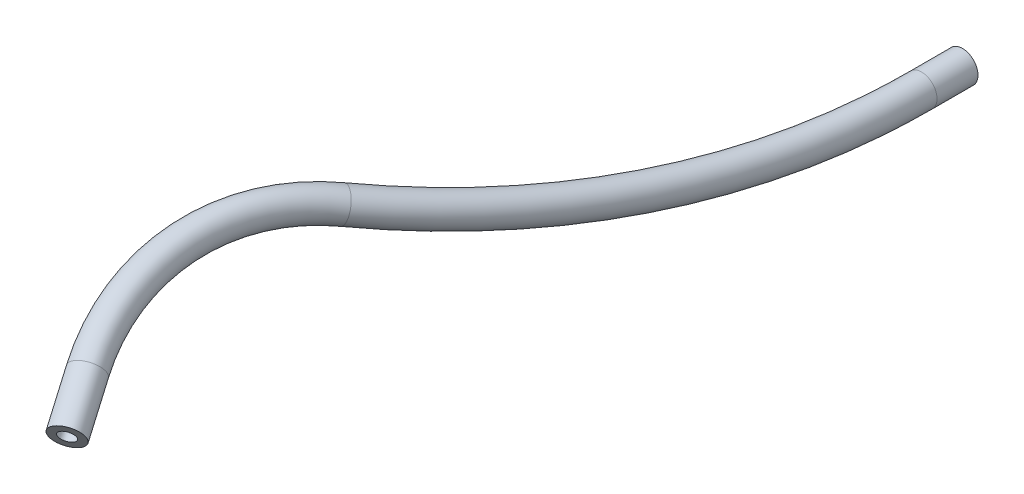
ISO-10303-21;
HEADER;
FILE_DESCRIPTION(('STEP AP214'),'2;1');
FILE_NAME('part.step','',(''),(''),'','','');
FILE_SCHEMA(('AUTOMOTIVE_DESIGN { 1 0 10303 214 1 1 1 1 }'));
ENDSEC;
DATA;
#1=APPLICATION_CONTEXT('core data for automotive mechanical design processes');
#2=APPLICATION_PROTOCOL_DEFINITION('international standard','automotive_design',2000,#1);
#3=PRODUCT_CONTEXT('',#1,'mechanical');
#4=PRODUCT('Part','Part','',(#3));
#5=PRODUCT_RELATED_PRODUCT_CATEGORY('part','',(#4));
#6=PRODUCT_DEFINITION_FORMATION('','',#4);
#7=PRODUCT_DEFINITION_CONTEXT('part definition',#1,'design');
#8=PRODUCT_DEFINITION('design','',#6,#7);
#9=PRODUCT_DEFINITION_SHAPE('','',#8);
#10=(LENGTH_UNIT() NAMED_UNIT(*) SI_UNIT(.MILLI.,.METRE.));
#11=(NAMED_UNIT(*) PLANE_ANGLE_UNIT() SI_UNIT($,.RADIAN.));
#12=(NAMED_UNIT(*) SI_UNIT($,.STERADIAN.) SOLID_ANGLE_UNIT());
#13=UNCERTAINTY_MEASURE_WITH_UNIT(LENGTH_MEASURE(1.E-05),#10,'distance_accuracy_value','');
#14=(GEOMETRIC_REPRESENTATION_CONTEXT(3) GLOBAL_UNCERTAINTY_ASSIGNED_CONTEXT((#13)) GLOBAL_UNIT_ASSIGNED_CONTEXT((#10,
#11,#12)) REPRESENTATION_CONTEXT('',''));
#15=CARTESIAN_POINT('',(0.,0.,0.));
#16=DIRECTION('',(0.,0.,1.));
#17=DIRECTION('',(1.,0.,0.));
#18=AXIS2_PLACEMENT_3D('',#15,#16,#17);
#19=CARTESIAN_POINT('',(-68.8755404402001,55.0059143947892,306.165794710013));
#20=DIRECTION('',(-0.406224259767803,0.462466021004912,-0.788103438764218));
#21=DIRECTION('',(0.,0.862471404103117,0.506105796355266));
#22=AXIS2_PLACEMENT_3D('',#19,#20,#21);
#23=PLANE('',#22);
#24=CARTESIAN_POINT('',(-68.8755404401991,55.0059143947879,306.165794710011));
#25=DIRECTION('',(-0.406224259767803,0.462466021004912,-0.788103438764218));
#26=DIRECTION('',(0.,0.862471404103117,0.506105796355266));
#27=AXIS2_PLACEMENT_3D('',#24,#25,#26);
#28=CIRCLE('',#27,3.175);
#29=CARTESIAN_POINT('',(-68.8755404401991,57.7442611028153,307.772680613439));
#30=VERTEX_POINT('',#29);
#31=EDGE_CURVE('E94',#30,#30,#28,.F.);
#32=ORIENTED_EDGE('',*,*,#31,.F.);
#33=EDGE_LOOP('',(#32));
#34=FACE_BOUND('',#33,.T.);
#35=CARTESIAN_POINT('',(-68.8755404402001,55.0059143947892,306.165794710013));
#36=DIRECTION('',(-0.406224259767803,0.462466021004912,-0.788103438764218));
#37=DIRECTION('',(0.,0.862471404103117,0.506105796355266));
#38=AXIS2_PLACEMENT_3D('',#35,#36,#37);
#39=CIRCLE('',#38,6.35);
#40=CARTESIAN_POINT('',(-68.8755404402001,60.482607810844,309.379566516869));
#41=VERTEX_POINT('',#40);
#42=EDGE_CURVE('E90',#41,#41,#39,.T.);
#43=ORIENTED_EDGE('',*,*,#42,.F.);
#44=EDGE_LOOP('',(#43));
#45=FACE_BOUND('',#44,.T.);
#46=ADVANCED_FACE('F65',(#34,#45),#23,.F.);
#47=CARTESIAN_POINT('',(-25.1447171389944,46.7830000000001,-16.7649999979995));
#48=DIRECTION('',(0.,0.,-1.));
#49=DIRECTION('',(-0.0458745099049047,0.998947210487614,0.));
#50=AXIS2_PLACEMENT_3D('',#47,#48,#49);
#51=PLANE('',#50);
#52=CARTESIAN_POINT('',(-25.1447171389943,46.783,-16.7649999979995));
#53=DIRECTION('',(0.,0.,-1.));
#54=DIRECTION('',(-1.,0.,0.));
#55=AXIS2_PLACEMENT_3D('',#52,#53,#54);
#56=CIRCLE('',#55,3.175);
#57=CARTESIAN_POINT('',(-28.3197171389943,46.783,-16.7649999979995));
#58=VERTEX_POINT('',#57);
#59=EDGE_CURVE('E95',#58,#58,#56,.F.);
#60=ORIENTED_EDGE('',*,*,#59,.T.);
#61=EDGE_LOOP('',(#60));
#62=FACE_BOUND('',#61,.T.);
#63=CARTESIAN_POINT('',(-25.1447171389944,46.7830000000001,-16.7649999979995));
#64=DIRECTION('',(0.,0.,-1.));
#65=DIRECTION('',(-0.0458745099049047,0.998947210487614,0.));
#66=AXIS2_PLACEMENT_3D('',#63,#64,#65);
#67=CIRCLE('',#66,6.35);
#68=CARTESIAN_POINT('',(-25.4360202768905,53.1263147865964,-16.7649999979995));
#69=VERTEX_POINT('',#68);
#70=EDGE_CURVE('E11',#69,#69,#67,.T.);
#71=ORIENTED_EDGE('',*,*,#70,.T.);
#72=EDGE_LOOP('',(#71));
#73=FACE_BOUND('',#72,.T.);
#74=ADVANCED_FACE('F121',(#62,#73),#51,.T.);
#75=CARTESIAN_POINT('',(-68.8755404402001,55.0059143947892,306.165794710013));
#76=DIRECTION('',(-0.406224259767802,0.46246602100491,-0.788103438764219));
#77=DIRECTION('',(0.,0.862471404103118,0.506105796355264));
#78=AXIS2_PLACEMENT_3D('',#75,#76,#77);
#79=CYLINDRICAL_SURFACE('',#78,6.35);
#80=CARTESIAN_POINT('',(-77.7622088710939,65.1229423427866,288.925037219192));
#81=DIRECTION('',(-0.406224259767803,0.462466021004912,-0.788103438764218));
#82=DIRECTION('',(0.,0.862471404103117,0.506105796355266));
#83=AXIS2_PLACEMENT_3D('',#80,#81,#82);
#84=CIRCLE('',#83,6.35);
#85=CARTESIAN_POINT('',(-81.8557765954319,68.0833704535112,292.772252925065));
#86=VERTEX_POINT('',#85);
#87=EDGE_CURVE('E84',#86,#86,#84,.T.);
#88=ORIENTED_EDGE('',*,*,#87,.F.);
#89=EDGE_LOOP('',(#88));
#90=FACE_BOUND('',#89,.T.);
#91=ORIENTED_EDGE('',*,*,#42,.T.);
#92=EDGE_LOOP('',(#91));
#93=FACE_BOUND('',#92,.T.);
#94=ADVANCED_FACE('F125',(#90,#93),#79,.T.);
#95=CARTESIAN_POINT('',(-21.2927333932328,24.2847703959514,235.853910126506));
#96=DIRECTION('',(-0.647611041530345,-0.754171205141536,-0.10874618256907));
#97=DIRECTION('',(0.758670463329731,-0.651474579758145,0.));
#98=AXIS2_PLACEMENT_3D('',#95,#96,#97);
#99=TOROIDAL_SURFACE('',#98,87.5962469492411,6.35);
#100=CARTESIAN_POINT('',(-73.6742803902493,76.0968408800557,188.474744178364));
#101=DIRECTION('',(0.472239039896633,-0.285251692895094,-0.834039424066986));
#102=DIRECTION('',(0.0330745174535237,0.951258769245351,-0.306615117417645));
#103=AXIS2_PLACEMENT_3D('',#100,#101,#102);
#104=CIRCLE('',#103,6.35);
#105=CARTESIAN_POINT('',(-77.4715072694321,79.8527854442657,185.040148356638));
#106=VERTEX_POINT('',#105);
#107=EDGE_CURVE('E78',#106,#106,#104,.T.);
#108=CARTESIAN_POINT('',(-21.2927333932328,24.2847703959514,235.853910126506));
#109=DIRECTION('',(-0.647611041530345,-0.754171205141536,-0.10874618256907));
#110=DIRECTION('',(0.758670463329731,-0.651474579758145,0.));
#111=AXIS2_PLACEMENT_3D('',#108,#109,#110);
#112=CIRCLE('',#111,93.9462469492411);
#113=EDGE_CURVE('',#86,#106,#112,.T.);
#114=ORIENTED_EDGE('',*,*,#87,.T.);
#115=ORIENTED_EDGE('',*,*,#107,.F.);
#116=ORIENTED_EDGE('',*,*,#113,.T.);
#117=ORIENTED_EDGE('',*,*,#113,.F.);
#118=EDGE_LOOP('',(#114,#116,#115,#117));
#119=FACE_BOUND('',#118,.T.);
#120=ADVANCED_FACE('F127',(#119),#99,.T.);
#121=CARTESIAN_POINT('',(-317.560930920046,223.414351845195,4.9960036108132E-13));
#122=DIRECTION('',(0.517036770702821,0.855963187141362,0.));
#123=DIRECTION('',(-0.855963187141362,0.517036770702821,0.));
#124=AXIS2_PLACEMENT_3D('',#121,#122,#123);
#125=TOROIDAL_SURFACE('',#124,341.622418082752,6.35);
#126=CARTESIAN_POINT('',(-25.1447171389942,46.7829999999999,4.71844785465692E-13));
#127=DIRECTION('',(0.,0.,-1.));
#128=DIRECTION('',(-0.0458745099049047,0.998947210487614,0.));
#129=AXIS2_PLACEMENT_3D('',#126,#127,#128);
#130=CIRCLE('',#129,6.35);
#131=CARTESIAN_POINT('',(-25.4360202768904,53.1263147865963,4.89469575981616E-13));
#132=VERTEX_POINT('',#131);
#133=EDGE_CURVE('E72',#132,#132,#130,.T.);
#134=ORIENTED_EDGE('',*,*,#133,.F.);
#135=EDGE_LOOP('',(#134));
#136=FACE_BOUND('',#135,.T.);
#137=ORIENTED_EDGE('',*,*,#107,.T.);
#138=EDGE_LOOP('',(#137));
#139=FACE_BOUND('',#138,.T.);
#140=ADVANCED_FACE('F134',(#136,#139),#125,.T.);
#141=CARTESIAN_POINT('',(-25.1447171389943,46.7830000000001,4.71844785465692E-13));
#142=DIRECTION('',(0.,0.,-1.));
#143=DIRECTION('',(-1.,0.,0.));
#144=AXIS2_PLACEMENT_3D('',#141,#142,#143);
#145=CYLINDRICAL_SURFACE('',#144,6.35);
#146=ORIENTED_EDGE('',*,*,#70,.F.);
#147=EDGE_LOOP('',(#146));
#148=FACE_BOUND('',#147,.T.);
#149=ORIENTED_EDGE('',*,*,#133,.T.);
#150=EDGE_LOOP('',(#149));
#151=FACE_BOUND('',#150,.T.);
#152=ADVANCED_FACE('F140',(#148,#151),#145,.T.);
#153=CARTESIAN_POINT('',(-25.1447171389943,46.783,4.71844785465692E-13));
#154=DIRECTION('',(0.,0.,-1.));
#155=DIRECTION('',(-1.,0.,0.));
#156=AXIS2_PLACEMENT_3D('',#153,#154,#155);
#157=CYLINDRICAL_SURFACE('',#156,3.175);
#158=CARTESIAN_POINT('',(-25.1447171389943,46.7829999999999,4.71844785465692E-13));
#159=DIRECTION('',(0.,0.,-1.));
#160=DIRECTION('',(-0.0458745099049047,0.998947210487613,0.));
#161=AXIS2_PLACEMENT_3D('',#158,#159,#160);
#162=CIRCLE('',#161,3.175);
#163=CARTESIAN_POINT('',(-25.2903687079423,49.9546573932981,4.72902272896647E-13));
#164=VERTEX_POINT('',#163);
#165=EDGE_CURVE('E100',#164,#164,#162,.T.);
#166=ORIENTED_EDGE('',*,*,#165,.F.);
#167=EDGE_LOOP('',(#166));
#168=FACE_BOUND('',#167,.T.);
#169=ORIENTED_EDGE('',*,*,#59,.F.);
#170=EDGE_LOOP('',(#169));
#171=FACE_BOUND('',#170,.T.);
#172=ADVANCED_FACE('F122',(#168,#171),#157,.F.);
#173=CARTESIAN_POINT('',(-66.8444191413509,52.6935842897528,310.10631190385));
#174=DIRECTION('',(-0.406224259767802,0.46246602100491,-0.788103438764219));
#175=DIRECTION('',(0.,0.862471404103118,0.506105796355264));
#176=AXIS2_PLACEMENT_3D('',#173,#174,#175);
#177=CYLINDRICAL_SURFACE('',#176,3.175);
#178=ORIENTED_EDGE('',*,*,#31,.T.);
#179=EDGE_LOOP('',(#178));
#180=FACE_BOUND('',#179,.T.);
#181=CARTESIAN_POINT('',(-77.7622088710933,65.1229423427857,288.925037219192));
#182=DIRECTION('',(-0.406224259767803,0.462466021004912,-0.788103438764218));
#183=DIRECTION('',(0.,0.862471404103117,0.506105796355266));
#184=AXIS2_PLACEMENT_3D('',#181,#182,#183);
#185=CIRCLE('',#184,3.175);
#186=CARTESIAN_POINT('',(-79.8089927332633,66.6031563981487,290.84864507213));
#187=VERTEX_POINT('',#186);
#188=EDGE_CURVE('E99',#187,#187,#185,.T.);
#189=ORIENTED_EDGE('',*,*,#188,.T.);
#190=EDGE_LOOP('',(#189));
#191=FACE_BOUND('',#190,.T.);
#192=ADVANCED_FACE('F116',(#180,#191),#177,.F.);
#193=CARTESIAN_POINT('',(-21.292733393233,24.2847703959511,235.853910126506));
#194=DIRECTION('',(-0.647611041530345,-0.754171205141536,-0.10874618256907));
#195=DIRECTION('',(0.758670463329731,-0.651474579758145,0.));
#196=AXIS2_PLACEMENT_3D('',#193,#194,#195);
#197=TOROIDAL_SURFACE('',#196,87.5962469492409,3.175);
#198=CARTESIAN_POINT('',(-73.6742803902493,76.0968408800557,188.474744178364));
#199=DIRECTION('',(0.472239039896632,-0.285251692895096,-0.834039424066985));
#200=DIRECTION('',(0.0330745174535249,0.95125876924535,-0.306615117417646));
#201=AXIS2_PLACEMENT_3D('',#198,#199,#200);
#202=CIRCLE('',#201,3.175);
#203=CARTESIAN_POINT('',(-75.5728938298412,77.9748131621613,186.7574462675));
#204=VERTEX_POINT('',#203);
#205=EDGE_CURVE('E104',#204,#204,#202,.T.);
#206=CARTESIAN_POINT('',(-21.292733393233,24.2847703959511,235.853910126506));
#207=DIRECTION('',(-0.647611041530345,-0.754171205141536,-0.10874618256907));
#208=DIRECTION('',(0.758670463329731,-0.651474579758145,0.));
#209=AXIS2_PLACEMENT_3D('',#206,#207,#208);
#210=CIRCLE('',#209,90.7712469492409);
#211=EDGE_CURVE('',#187,#204,#210,.T.);
#212=ORIENTED_EDGE('',*,*,#188,.F.);
#213=ORIENTED_EDGE('',*,*,#205,.T.);
#214=ORIENTED_EDGE('',*,*,#211,.T.);
#215=ORIENTED_EDGE('',*,*,#211,.F.);
#216=EDGE_LOOP('',(#212,#214,#213,#215));
#217=FACE_BOUND('',#216,.T.);
#218=ADVANCED_FACE('F210',(#217),#197,.F.);
#219=CARTESIAN_POINT('',(-317.560930920046,223.414351845195,4.9960036108132E-13));
#220=DIRECTION('',(0.517036770702821,0.855963187141362,0.));
#221=DIRECTION('',(-0.855963187141362,0.517036770702821,0.));
#222=AXIS2_PLACEMENT_3D('',#219,#220,#221);
#223=TOROIDAL_SURFACE('',#222,341.622418082752,3.175);
#224=ORIENTED_EDGE('',*,*,#165,.T.);
#225=EDGE_LOOP('',(#224));
#226=FACE_BOUND('',#225,.T.);
#227=ORIENTED_EDGE('',*,*,#205,.F.);
#228=EDGE_LOOP('',(#227));
#229=FACE_BOUND('',#228,.T.);
#230=ADVANCED_FACE('F149',(#226,#229),#223,.F.);
#231=CLOSED_SHELL('',(#46,#74,#94,#120,#140,#152,#172,#192,#218,#230));
#232=MANIFOLD_SOLID_BREP('B2',#231);
#233=ADVANCED_BREP_SHAPE_REPRESENTATION('',(#18,#232),#14);
#234=SHAPE_DEFINITION_REPRESENTATION(#9,#233);
ENDSEC;
END-ISO-10303-21;
